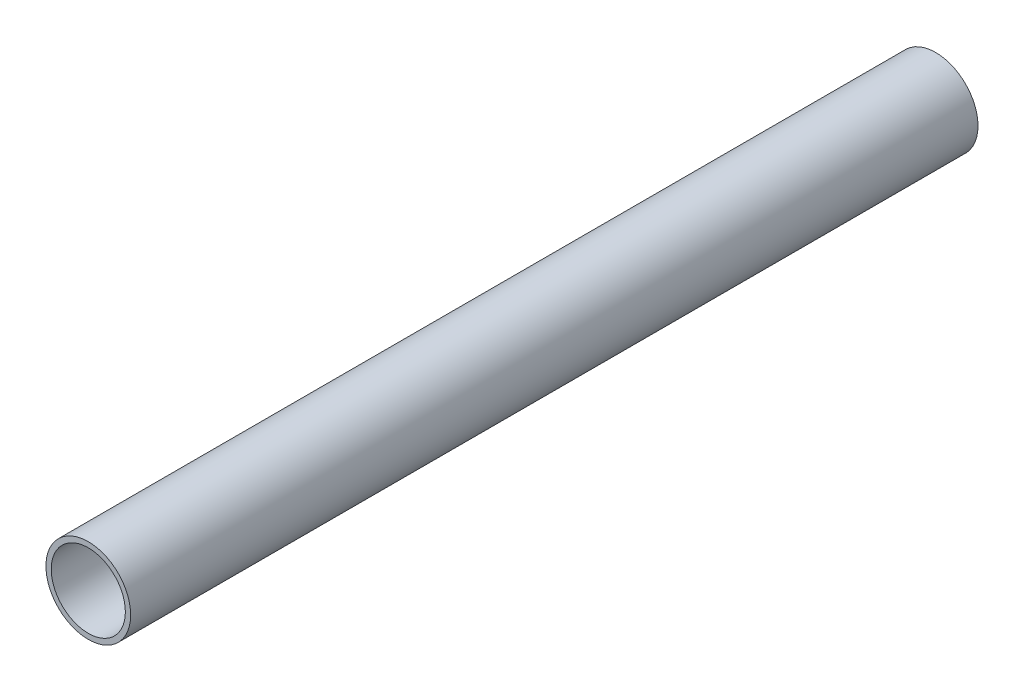
ISO-10303-21;
HEADER;
FILE_DESCRIPTION(('STEP AP214'),'2;1');
FILE_NAME('part.step','',(''),(''),'','','');
FILE_SCHEMA(('AUTOMOTIVE_DESIGN { 1 0 10303 214 1 1 1 1 }'));
ENDSEC;
DATA;
#1=APPLICATION_CONTEXT('core data for automotive mechanical design processes');
#2=APPLICATION_PROTOCOL_DEFINITION('international standard','automotive_design',2000,#1);
#3=PRODUCT_CONTEXT('',#1,'mechanical');
#4=PRODUCT('Part','Part','',(#3));
#5=PRODUCT_RELATED_PRODUCT_CATEGORY('part','',(#4));
#6=PRODUCT_DEFINITION_FORMATION('','',#4);
#7=PRODUCT_DEFINITION_CONTEXT('part definition',#1,'design');
#8=PRODUCT_DEFINITION('design','',#6,#7);
#9=PRODUCT_DEFINITION_SHAPE('','',#8);
#10=(LENGTH_UNIT() NAMED_UNIT(*) SI_UNIT(.MILLI.,.METRE.));
#11=(NAMED_UNIT(*) PLANE_ANGLE_UNIT() SI_UNIT($,.RADIAN.));
#12=(NAMED_UNIT(*) SI_UNIT($,.STERADIAN.) SOLID_ANGLE_UNIT());
#13=UNCERTAINTY_MEASURE_WITH_UNIT(LENGTH_MEASURE(1.E-05),#10,'distance_accuracy_value','');
#14=(GEOMETRIC_REPRESENTATION_CONTEXT(3) GLOBAL_UNCERTAINTY_ASSIGNED_CONTEXT((#13)) GLOBAL_UNIT_ASSIGNED_CONTEXT((#10,
#11,#12)) REPRESENTATION_CONTEXT('',''));
#15=CARTESIAN_POINT('',(0.,0.,0.));
#16=DIRECTION('',(0.,0.,1.));
#17=DIRECTION('',(1.,0.,0.));
#18=AXIS2_PLACEMENT_3D('',#15,#16,#17);
#19=CARTESIAN_POINT('',(0.,0.,127.));
#20=DIRECTION('',(0.,0.,1.));
#21=DIRECTION('',(1.,0.,0.));
#22=AXIS2_PLACEMENT_3D('',#19,#20,#21);
#23=PLANE('',#22);
#24=CARTESIAN_POINT('',(0.,0.,127.));
#25=DIRECTION('',(0.,0.,1.));
#26=DIRECTION('',(1.,0.,0.));
#27=AXIS2_PLACEMENT_3D('',#24,#25,#26);
#28=CIRCLE('',#27,12.7);
#29=CARTESIAN_POINT('',(12.7,0.,127.));
#30=VERTEX_POINT('',#29);
#31=EDGE_CURVE('E10',#30,#30,#28,.T.);
#32=ORIENTED_EDGE('',*,*,#31,.T.);
#33=EDGE_LOOP('',(#32));
#34=FACE_BOUND('',#33,.T.);
#35=CARTESIAN_POINT('',(0.,0.,127.));
#36=DIRECTION('',(0.,0.,1.));
#37=DIRECTION('',(1.,0.,0.));
#38=AXIS2_PLACEMENT_3D('',#35,#36,#37);
#39=CIRCLE('',#38,11.1125);
#40=CARTESIAN_POINT('',(11.1125,0.,127.));
#41=VERTEX_POINT('',#40);
#42=EDGE_CURVE('E50',#41,#41,#39,.T.);
#43=ORIENTED_EDGE('',*,*,#42,.F.);
#44=EDGE_LOOP('',(#43));
#45=FACE_BOUND('',#44,.T.);
#46=ADVANCED_FACE('F32',(#34,#45),#23,.T.);
#47=CARTESIAN_POINT('',(0.,0.,-127.));
#48=DIRECTION('',(0.,0.,1.));
#49=DIRECTION('',(1.,0.,0.));
#50=AXIS2_PLACEMENT_3D('',#47,#48,#49);
#51=PLANE('',#50);
#52=CARTESIAN_POINT('',(0.,0.,-127.));
#53=DIRECTION('',(0.,0.,1.));
#54=DIRECTION('',(1.,0.,0.));
#55=AXIS2_PLACEMENT_3D('',#52,#53,#54);
#56=CIRCLE('',#55,12.7);
#57=CARTESIAN_POINT('',(12.7,0.,-127.));
#58=VERTEX_POINT('',#57);
#59=EDGE_CURVE('E45',#58,#58,#56,.T.);
#60=ORIENTED_EDGE('',*,*,#59,.F.);
#61=EDGE_LOOP('',(#60));
#62=FACE_BOUND('',#61,.T.);
#63=CARTESIAN_POINT('',(0.,0.,-127.));
#64=DIRECTION('',(0.,0.,1.));
#65=DIRECTION('',(1.,0.,0.));
#66=AXIS2_PLACEMENT_3D('',#63,#64,#65);
#67=CIRCLE('',#66,11.1125);
#68=CARTESIAN_POINT('',(11.1125,0.,-127.));
#69=VERTEX_POINT('',#68);
#70=EDGE_CURVE('E52',#69,#69,#67,.T.);
#71=ORIENTED_EDGE('',*,*,#70,.T.);
#72=EDGE_LOOP('',(#71));
#73=FACE_BOUND('',#72,.T.);
#74=ADVANCED_FACE('F72',(#62,#73),#51,.F.);
#75=CARTESIAN_POINT('',(0.,0.,127.));
#76=DIRECTION('',(0.,0.,-1.));
#77=DIRECTION('',(-1.,0.,0.));
#78=AXIS2_PLACEMENT_3D('',#75,#76,#77);
#79=CYLINDRICAL_SURFACE('',#78,12.7);
#80=CARTESIAN_POINT('',(0.,-12.7,2.15265));
#81=CARTESIAN_POINT('',(0.119993701353637,-12.699997924655,2.15264521569791));
#82=CARTESIAN_POINT('',(0.240052139056535,-12.6982816971202,2.14258301495631));
#83=CARTESIAN_POINT('',(0.476799688607567,-12.6916006090816,2.10261799133396));
#84=CARTESIAN_POINT('',(0.593485634190835,-12.6866327930575,2.07269711763207));
#85=CARTESIAN_POINT('',(0.82002887207911,-12.6740055416238,1.99394582791418));
#86=CARTESIAN_POINT('',(0.929891738656801,-12.6663483383404,1.94513108992905));
#87=CARTESIAN_POINT('',(1.13985413365083,-12.6491834953183,1.83001925322608));
#88=CARTESIAN_POINT('',(1.23995473440426,-12.6396760591631,1.76372407761834));
#89=CARTESIAN_POINT('',(1.42855298284765,-12.6197591583024,1.61483711826863));
#90=CARTESIAN_POINT('',(1.51694025925731,-12.6093424637949,1.53210647721694));
#91=CARTESIAN_POINT('',(1.67864928753068,-12.5888361898486,1.35299586734682));
#92=CARTESIAN_POINT('',(1.75197007217435,-12.578746631446,1.25661502289997));
#93=CARTESIAN_POINT('',(1.8819093093905,-12.5599669596968,1.05217888262664));
#94=CARTESIAN_POINT('',(1.93841821276847,-12.5512861858316,0.94405302465243));
#95=CARTESIAN_POINT('',(2.0324289623014,-12.5364074652641,0.719671953405697));
#96=CARTESIAN_POINT('',(2.06993213764875,-12.5302093449403,0.603417309278584));
#97=CARTESIAN_POINT('',(2.12451825980265,-12.521069779767,0.367250140082762));
#98=CARTESIAN_POINT('',(2.14179201185973,-12.5180979243859,0.247382915742399));
#99=CARTESIAN_POINT('',(2.15602062737252,-12.5156554210272,0.00641741593518305));
#100=CARTESIAN_POINT('',(2.15297697806635,-12.5161845167791,-0.114680768777187));
#101=CARTESIAN_POINT('',(2.12681251505848,-12.5206563793401,-0.353305981067015));
#102=CARTESIAN_POINT('',(2.10390638089315,-12.5245626433926,-0.47085733136629));
#103=CARTESIAN_POINT('',(2.03900422810767,-12.5352915403332,-0.700423922620434));
#104=CARTESIAN_POINT('',(1.99700753431064,-12.5421142763678,-0.812438967617122));
#105=CARTESIAN_POINT('',(1.89489974243954,-12.5579466335029,-1.02839404990791));
#106=CARTESIAN_POINT('',(1.83469981784367,-12.5669669351715,-1.13229127304949));
#107=CARTESIAN_POINT('',(1.69795745284572,-12.5861706944476,-1.32859082454557));
#108=CARTESIAN_POINT('',(1.62141364926346,-12.5963542490445,-1.42099219305693));
#109=CARTESIAN_POINT('',(1.45298822368162,-12.6168973037264,-1.59291947260541));
#110=CARTESIAN_POINT('',(1.36092248192332,-12.6272573853007,-1.67226505514619));
#111=CARTESIAN_POINT('',(1.16468843348318,-12.6468655373414,-1.81440923333888));
#112=CARTESIAN_POINT('',(1.06052004378657,-12.6561136001792,-1.87720771548088));
#113=CARTESIAN_POINT('',(0.842865707116219,-12.6724695158738,-1.98449278841323));
#114=CARTESIAN_POINT('',(0.729371575953342,-12.6795754627405,-2.02896308417802));
#115=CARTESIAN_POINT('',(0.496377924391536,-12.6908312775343,-2.09816015761149));
#116=CARTESIAN_POINT('',(0.376878924772436,-12.6949814013368,-2.12288864428317));
#117=CARTESIAN_POINT('',(0.13682156830077,-12.6998234607268,-2.15165484616626));
#118=CARTESIAN_POINT('',(0.0162936738980586,-12.7005567587157,-2.1559400528431));
#119=CARTESIAN_POINT('',(-0.223757685900267,-12.6985959571487,-2.14435839886969));
#120=CARTESIAN_POINT('',(-0.343281191124425,-12.6959019941509,-2.12849234113982));
#121=CARTESIAN_POINT('',(-0.577163824306228,-12.6874149953279,-2.07726438091067));
#122=CARTESIAN_POINT('',(-0.691550637047852,-12.6816414991218,-2.04202535697163));
#123=CARTESIAN_POINT('',(-0.912792879538037,-12.6676401846811,-1.95318301945154));
#124=CARTESIAN_POINT('',(-1.01964787396849,-12.659412224729,-1.89957864545212));
#125=CARTESIAN_POINT('',(-1.22386585444161,-12.6413120190352,-1.77496287994788));
#126=CARTESIAN_POINT('',(-1.32113347743227,-12.6314254737356,-1.70379732659812));
#127=CARTESIAN_POINT('',(-1.50243417999271,-12.6111470118822,-1.54629094516506));
#128=CARTESIAN_POINT('',(-1.58646626227725,-12.6007550573234,-1.45994897458952));
#129=CARTESIAN_POINT('',(-1.73983091872671,-12.5805028160375,-1.27342929706947));
#130=CARTESIAN_POINT('',(-1.80899605102726,-12.57064943245,-1.1731130434988));
#131=CARTESIAN_POINT('',(-1.92949304289248,-12.5527201526261,-0.962140427344519));
#132=CARTESIAN_POINT('',(-1.98082548162912,-12.5446441986652,-0.851484400725224));
#133=CARTESIAN_POINT('',(-2.06395119147783,-12.5312362762397,-0.623435947736226));
#134=CARTESIAN_POINT('',(-2.09582695001385,-12.5258927394491,-0.506074299801616));
#135=CARTESIAN_POINT('',(-2.13939342253033,-12.5185259687774,-0.267564172942967));
#136=CARTESIAN_POINT('',(-2.15108595760676,-12.5165024353392,-0.146416036671303));
#137=CARTESIAN_POINT('',(-2.15390196100752,-12.5160179945158,0.0945554571032123));
#138=CARTESIAN_POINT('',(-2.14528905634438,-12.5175114258408,0.214375723377891));
#139=CARTESIAN_POINT('',(-2.10830963854223,-12.5237924174687,0.450835696296924));
#140=CARTESIAN_POINT('',(-2.07994319583734,-12.5285799660259,0.567475414280446));
#141=CARTESIAN_POINT('',(-2.00436426909118,-12.5408921577297,0.794156195030276));
#142=CARTESIAN_POINT('',(-1.95717524432756,-12.54841339275,0.904205276316109));
#143=CARTESIAN_POINT('',(-1.84531796369356,-12.5653486794715,1.11486715754802));
#144=CARTESIAN_POINT('',(-1.78064879229103,-12.5747628303085,1.21547946286595));
#145=CARTESIAN_POINT('',(-1.63472921360746,-12.5945675841662,1.40574225667553));
#146=CARTESIAN_POINT('',(-1.55328511938664,-12.604968749501,1.4952431219012));
#147=CARTESIAN_POINT('',(-1.37653549880974,-12.6254920298366,1.65939778245155));
#148=CARTESIAN_POINT('',(-1.28122678085857,-12.6356140799461,1.73404814984292));
#149=CARTESIAN_POINT('',(-1.07864040437983,-12.6545228762308,1.86687336471781));
#150=CARTESIAN_POINT('',(-0.971281851993275,-12.6632995312268,1.92492628429853));
#151=CARTESIAN_POINT('',(-0.748230237869504,-12.6784304467392,2.02208350885933));
#152=CARTESIAN_POINT('',(-0.632545546968665,-12.6847871008901,2.06120654791026));
#153=CARTESIAN_POINT('',(-0.430353999691942,-12.6929863246093,2.11097207888548));
#154=CARTESIAN_POINT('',(-0.345065331390136,-12.6956022929582,2.12657605493461));
#155=CARTESIAN_POINT('',(-0.173195669668458,-12.699109864005,2.14741664800654));
#156=CARTESIAN_POINT('',(-0.0866146997632351,-12.7000014980402,2.15265345343867));
#157=CARTESIAN_POINT('',(0.,-12.7,2.15265));
#158=B_SPLINE_CURVE_WITH_KNOTS('',3,(#80,#81,#82,#83,#84,#85,#86,#87,#88,#89,#90,#91,#92,#93,
#94,#95,#96,#97,#98,#99,#100,#101,#102,#103,#104,#105,#106,#107,#108,#109,#110,#111,#112,#113,
#114,#115,#116,#117,#118,#119,#120,#121,#122,#123,#124,#125,#126,#127,#128,#129,#130,#131,#132,
#133,#134,#135,#136,#137,#138,#139,#140,#141,#142,#143,#144,#145,#146,#147,#148,#149,#150,#151,
#152,#153,#154,#155,#156,#157),.UNSPECIFIED.,.T.,.F.,(4,2,2,2,2,2,2,2,2,2,2,2,2,2,2,2,2,2,2,2,2,
2,2,2,2,2,2,2,2,2,2,2,2,2,2,2,2,2,4),(0.,0.35966448271259,0.719656336084689,1.07935010829273,
1.43900432529437,1.80183731415742,2.16469358845304,2.52986496472287,2.89501079869205,
3.25668408340224,3.61833089384128,3.97611696360602,4.33391568819509,4.69348934236996,
5.05309299892566,5.41730863180251,5.78152676306331,6.14606801452233,6.51057770506053,
6.87066315559292,7.23073425909155,7.58854742657669,7.94638125773659,8.30747566629147,
8.66859726995955,9.03359461183655,9.39858009818561,9.76200726623958,10.125401641199,
10.4841040724102,10.842805224622,11.2010607043238,11.5593349514874,11.9220045380721,
12.2847577426139,12.6501110757777,13.0151020914752,13.2747223632014,13.5343379166365),.UNSPECIFIED.);
#159=CARTESIAN_POINT('',(0.,-12.7,2.15265));
#160=VERTEX_POINT('',#159);
#161=EDGE_CURVE('E55',#160,#160,#158,.T.);
#162=ORIENTED_EDGE('',*,*,#161,.T.);
#163=EDGE_LOOP('',(#162));
#164=FACE_BOUND('',#163,.T.);
#165=ORIENTED_EDGE('',*,*,#31,.F.);
#166=EDGE_LOOP('',(#165));
#167=FACE_BOUND('',#166,.T.);
#168=ORIENTED_EDGE('',*,*,#59,.T.);
#169=EDGE_LOOP('',(#168));
#170=FACE_BOUND('',#169,.T.);
#171=ADVANCED_FACE('F34',(#164,#167,#170),#79,.T.);
#172=CARTESIAN_POINT('',(0.,0.,127.));
#173=DIRECTION('',(0.,0.,-1.));
#174=DIRECTION('',(-1.,0.,0.));
#175=AXIS2_PLACEMENT_3D('',#172,#173,#174);
#176=CYLINDRICAL_SURFACE('',#175,11.1125);
#177=CARTESIAN_POINT('',(0.,-11.1125,2.15265));
#178=CARTESIAN_POINT('',(0.119715564894237,-11.1124978096805,2.15264550662146));
#179=CARTESIAN_POINT('',(0.239488771545794,-11.1105455305412,2.14262962224009));
#180=CARTESIAN_POINT('',(0.475654974406331,-11.1029457411639,2.10285945950089));
#181=CARTESIAN_POINT('',(0.592045118040553,-11.0972952018737,2.07308900092414));
#182=CARTESIAN_POINT('',(0.817996013251973,-11.0829304284007,1.99475958470326));
#183=CARTESIAN_POINT('',(0.927563006290755,-11.0742190440612,1.94621809987599));
#184=CARTESIAN_POINT('',(1.13698876504882,-11.0546817641964,1.83177529251704));
#185=CARTESIAN_POINT('',(1.23684821384948,-11.043856017612,1.76587519265452));
#186=CARTESIAN_POINT('',(1.42530570339587,-11.0211289808798,1.61769488074096));
#187=CARTESIAN_POINT('',(1.51376217259876,-11.0092168233689,1.53523626492689));
#188=CARTESIAN_POINT('',(1.67567746527397,-10.9857394122567,1.35666326420184));
#189=CARTESIAN_POINT('',(1.74913516620467,-10.9741741846757,1.26054785809819));
#190=CARTESIAN_POINT('',(1.87956330252496,-10.9525942275641,1.05638039255871));
#191=CARTESIAN_POINT('',(1.93638846154543,-10.9425934958424,0.948233916244503));
#192=CARTESIAN_POINT('',(2.03100811864226,-10.9254285773768,0.723702824835272));
#193=CARTESIAN_POINT('',(2.06880437419359,-10.9182641286919,0.607318971662265));
#194=CARTESIAN_POINT('',(2.12383639936396,-10.9076926262447,0.371135779400107));
#195=CARTESIAN_POINT('',(2.1413198010235,-10.9042403572009,0.251396204496595));
#196=CARTESIAN_POINT('',(2.15599872613136,-10.901347883527,0.0106373175962802));
#197=CARTESIAN_POINT('',(2.15319619335767,-10.9019072945017,-0.110381870679683));
#198=CARTESIAN_POINT('',(2.1275833144512,-10.9069338496668,-0.348462009097054));
#199=CARTESIAN_POINT('',(2.10505567179696,-10.9113457765434,-0.465554711552361));
#200=CARTESIAN_POINT('',(2.04107776533785,-10.9234934155876,-0.694266659027416));
#201=CARTESIAN_POINT('',(1.99962664852894,-10.9312292775855,-0.805885657060513));
#202=CARTESIAN_POINT('',(1.89870516982161,-10.9492102510755,-1.0213028147205));
#203=CARTESIAN_POINT('',(1.83912168497804,-10.9594710356645,-1.12504661466337));
#204=CARTESIAN_POINT('',(1.70370673827023,-10.9813355075827,-1.32116982181968));
#205=CARTESIAN_POINT('',(1.62787352030571,-10.9929393399918,-1.41354799905624));
#206=CARTESIAN_POINT('',(1.46059269865631,-11.0164223693683,-1.58595003734349));
#207=CARTESIAN_POINT('',(1.36890354292197,-11.0283029118128,-1.66573952312999));
#208=CARTESIAN_POINT('',(1.17331911044657,-11.0508213684825,-1.80884132507371));
#209=CARTESIAN_POINT('',(1.06942369517866,-11.0614592686025,-1.87215345420588));
#210=CARTESIAN_POINT('',(0.852123711315662,-11.080317546876,-1.98054218351575));
#211=CARTESIAN_POINT('',(0.738706081397317,-11.0885345323527,-2.02559322544363));
#212=CARTESIAN_POINT('',(0.505717960355587,-11.101599171843,-2.09593766673693));
#213=CARTESIAN_POINT('',(0.386148169298388,-11.1064472083091,-2.12123330883059));
#214=CARTESIAN_POINT('',(0.14626513962593,-11.1121748169489,-2.15101993669909));
#215=CARTESIAN_POINT('',(0.0259931680094963,-11.1131156025481,-2.155831863306));
#216=CARTESIAN_POINT('',(-0.213636517836665,-11.1110922567529,-2.14537704389766));
#217=CARTESIAN_POINT('',(-0.332994279812596,-11.1081283307069,-2.13011135376296));
#218=CARTESIAN_POINT('',(-0.566380920319129,-11.0986668012913,-2.08020137855022));
#219=CARTESIAN_POINT('',(-0.680446081113467,-11.0921990269423,-2.04572060559909));
#220=CARTESIAN_POINT('',(-0.901176122733679,-11.076452177144,-1.95853704029321));
#221=CARTESIAN_POINT('',(-1.00784047454465,-11.0671729009805,-1.90583294693087));
#222=CARTESIAN_POINT('',(-1.21210288138763,-11.0466797300168,-1.78299633571246));
#223=CARTESIAN_POINT('',(-1.3095816861682,-11.0354446827283,-1.71266912141135));
#224=CARTESIAN_POINT('',(-1.49146944981661,-11.0123383700199,-1.556844699349));
#225=CARTESIAN_POINT('',(-1.57587709847632,-11.0004670409816,-1.47134597268791));
#226=CARTESIAN_POINT('',(-1.73045544313724,-10.9772214584112,-1.28614855206029));
#227=CARTESIAN_POINT('',(-1.80040646810745,-10.9658566814833,-1.18626511446402));
#228=CARTESIAN_POINT('',(-1.92253811981723,-10.9451065243496,-0.975977167380971));
#229=CARTESIAN_POINT('',(-1.97471943306609,-10.9357210676807,-0.865573064557115));
#230=CARTESIAN_POINT('',(-2.05952460623772,-10.9200676380385,-0.637917380965256));
#231=CARTESIAN_POINT('',(-2.09224638582068,-10.9137840840475,-0.520703398672381));
#232=CARTESIAN_POINT('',(-2.13750325585919,-10.9050115520747,-0.2823072237109));
#233=CARTESIAN_POINT('',(-2.15004079623009,-10.9025221135741,-0.161125514457753));
#234=CARTESIAN_POINT('',(-2.15448703877357,-10.9016441213534,0.0795633503028439));
#235=CARTESIAN_POINT('',(-2.14674253924981,-10.9031866254365,0.199063984203305));
#236=CARTESIAN_POINT('',(-2.11160680251474,-10.9100452744419,0.435025105361218));
#237=CARTESIAN_POINT('',(-2.08421570195598,-10.9153613931168,0.551485613758524));
#238=CARTESIAN_POINT('',(-2.01071475665011,-10.9291383630531,0.777857337987074));
#239=CARTESIAN_POINT('',(-1.96464490436817,-10.9375924923746,0.887781974564256));
#240=CARTESIAN_POINT('',(-1.85513303329109,-10.9566972088693,1.098396415569));
#241=CARTESIAN_POINT('',(-1.7916896739344,-10.9673479655214,1.19908550656963));
#242=CARTESIAN_POINT('',(-1.64803640573923,-10.9898583766864,1.39010281442429));
#243=CARTESIAN_POINT('',(-1.56757504910954,-11.00173461306,1.48024001109722));
#244=CARTESIAN_POINT('',(-1.39269162425168,-11.0252362684604,1.6458484894116));
#245=CARTESIAN_POINT('',(-1.29826635362214,-11.0368616292502,1.72131639767256));
#246=CARTESIAN_POINT('',(-1.09703527753359,-11.0586844345217,1.85613235804902));
#247=CARTESIAN_POINT('',(-0.990118160347565,-11.0688669179221,1.91531677171207));
#248=CARTESIAN_POINT('',(-0.767691849265521,-11.0865100606938,2.01478654753188));
#249=CARTESIAN_POINT('',(-0.652190680886373,-11.0939732248468,2.05508931152416));
#250=CARTESIAN_POINT('',(-0.446990428388718,-11.1038502557282,2.10765287208178));
#251=CARTESIAN_POINT('',(-0.358475927673888,-11.1070752679367,2.12449735103881));
#252=CARTESIAN_POINT('',(-0.179985118233965,-11.1114009332401,2.14699744493965));
#253=CARTESIAN_POINT('',(-0.0900088511925621,-11.1125016468046,2.15265337837307));
#254=CARTESIAN_POINT('',(0.,-11.1125,2.15265));
#255=B_SPLINE_CURVE_WITH_KNOTS('',3,(#177,#178,#179,#180,#181,#182,#183,#184,#185,#186,#187,
#188,#189,#190,#191,#192,#193,#194,#195,#196,#197,#198,#199,#200,#201,#202,#203,#204,#205,#206,
#207,#208,#209,#210,#211,#212,#213,#214,#215,#216,#217,#218,#219,#220,#221,#222,#223,#224,#225,
#226,#227,#228,#229,#230,#231,#232,#233,#234,#235,#236,#237,#238,#239,#240,#241,#242,#243,#244,
#245,#246,#247,#248,#249,#250,#251,#252,#253,#254),.UNSPECIFIED.,.T.,.F.,(4,2,2,2,2,2,2,2,2,2,2,
2,2,2,2,2,2,2,2,2,2,2,2,2,2,2,2,2,2,2,2,2,2,2,2,2,2,2,4),(0.,0.358817472498826,
0.717929202080055,1.07670745773425,1.435460449284,1.79830888869081,2.16118447454642,
2.52714096919509,2.89306365856325,3.25447699365244,3.61585569893511,3.97213831430998,
4.32843699124522,4.68700574524941,5.04561326915472,5.41026279179702,5.77491645318725,
6.14007873672045,6.50519955924217,6.86457807934347,7.22393770050759,7.58028501909345,
7.93665778344416,8.29715608493233,8.65769049818399,9.02335503976495,9.38900545277723,
9.75280000648391,10.1165504003356,10.4741218735758,10.8316908597401,11.1884982758018,
11.5453332313316,11.9078636129836,12.2704772645114,12.6366118786249,13.0024083861871,
13.2721950919046,13.5419741178481),.UNSPECIFIED.);
#256=CARTESIAN_POINT('',(0.,-11.1125,2.15265));
#257=VERTEX_POINT('',#256);
#258=EDGE_CURVE('E37',#257,#257,#255,.T.);
#259=ORIENTED_EDGE('',*,*,#258,.F.);
#260=EDGE_LOOP('',(#259));
#261=FACE_BOUND('',#260,.T.);
#262=ORIENTED_EDGE('',*,*,#42,.T.);
#263=EDGE_LOOP('',(#262));
#264=FACE_BOUND('',#263,.T.);
#265=ORIENTED_EDGE('',*,*,#70,.F.);
#266=EDGE_LOOP('',(#265));
#267=FACE_BOUND('',#266,.T.);
#268=ADVANCED_FACE('F64',(#261,#264,#267),#176,.F.);
#269=CARTESIAN_POINT('',(0.,-12.7,0.));
#270=DIRECTION('',(0.,1.,0.));
#271=DIRECTION('',(0.,0.,1.));
#272=AXIS2_PLACEMENT_3D('',#269,#270,#271);
#273=CYLINDRICAL_SURFACE('',#272,2.15265);
#274=ORIENTED_EDGE('',*,*,#258,.T.);
#275=EDGE_LOOP('',(#274));
#276=FACE_BOUND('',#275,.T.);
#277=ORIENTED_EDGE('',*,*,#161,.F.);
#278=EDGE_LOOP('',(#277));
#279=FACE_BOUND('',#278,.T.);
#280=ADVANCED_FACE('F61',(#276,#279),#273,.F.);
#281=CLOSED_SHELL('',(#46,#74,#171,#268,#280));
#282=MANIFOLD_SOLID_BREP('B2',#281);
#283=ADVANCED_BREP_SHAPE_REPRESENTATION('',(#18,#282),#14);
#284=SHAPE_DEFINITION_REPRESENTATION(#9,#283);
ENDSEC;
END-ISO-10303-21;
